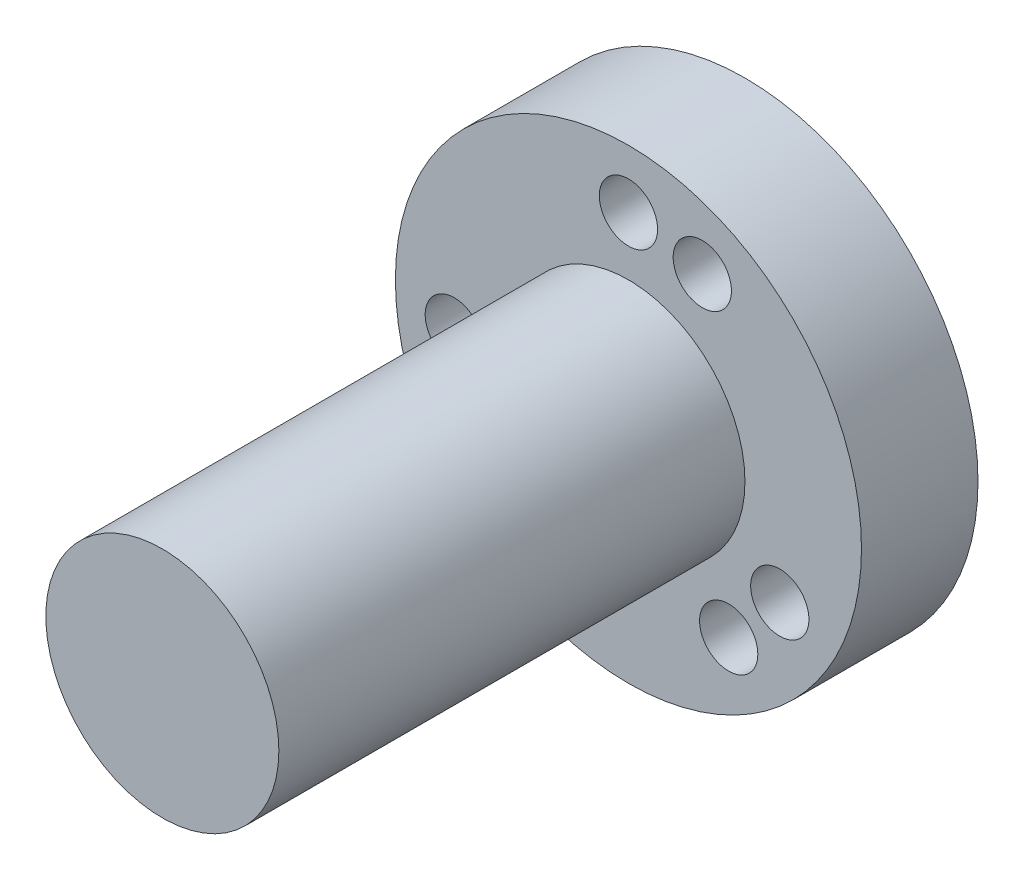
ISO-10303-21;
HEADER;
FILE_DESCRIPTION(('STEP AP214'),'2;1');
FILE_NAME('part.step','',(''),(''),'','','');
FILE_SCHEMA(('AUTOMOTIVE_DESIGN { 1 0 10303 214 1 1 1 1 }'));
ENDSEC;
DATA;
#1=APPLICATION_CONTEXT('core data for automotive mechanical design processes');
#2=APPLICATION_PROTOCOL_DEFINITION('international standard','automotive_design',2000,#1);
#3=PRODUCT_CONTEXT('',#1,'mechanical');
#4=PRODUCT('Part','Part','',(#3));
#5=PRODUCT_RELATED_PRODUCT_CATEGORY('part','',(#4));
#6=PRODUCT_DEFINITION_FORMATION('','',#4);
#7=PRODUCT_DEFINITION_CONTEXT('part definition',#1,'design');
#8=PRODUCT_DEFINITION('design','',#6,#7);
#9=PRODUCT_DEFINITION_SHAPE('','',#8);
#10=(LENGTH_UNIT() NAMED_UNIT(*) SI_UNIT(.MILLI.,.METRE.));
#11=(NAMED_UNIT(*) PLANE_ANGLE_UNIT() SI_UNIT($,.RADIAN.));
#12=(NAMED_UNIT(*) SI_UNIT($,.STERADIAN.) SOLID_ANGLE_UNIT());
#13=UNCERTAINTY_MEASURE_WITH_UNIT(LENGTH_MEASURE(1.E-05),#10,'distance_accuracy_value','');
#14=(GEOMETRIC_REPRESENTATION_CONTEXT(3) GLOBAL_UNCERTAINTY_ASSIGNED_CONTEXT((#13)) GLOBAL_UNIT_ASSIGNED_CONTEXT((#10,
#11,#12)) REPRESENTATION_CONTEXT('',''));
#15=CARTESIAN_POINT('',(0.,0.,0.));
#16=DIRECTION('',(0.,0.,1.));
#17=DIRECTION('',(1.,0.,0.));
#18=AXIS2_PLACEMENT_3D('',#15,#16,#17);
#19=CARTESIAN_POINT('',(0.,0.,1.));
#20=DIRECTION('',(0.,0.,-1.));
#21=DIRECTION('',(-1.,0.,0.));
#22=AXIS2_PLACEMENT_3D('',#19,#20,#21);
#23=CYLINDRICAL_SURFACE('',#22,2.5);
#24=CARTESIAN_POINT('',(0.,0.,1.));
#25=DIRECTION('',(0.,0.,1.));
#26=DIRECTION('',(1.,0.,0.));
#27=AXIS2_PLACEMENT_3D('',#24,#25,#26);
#28=CIRCLE('',#27,2.5);
#29=CARTESIAN_POINT('',(2.5,0.,1.));
#30=VERTEX_POINT('',#29);
#31=EDGE_CURVE('E10',#30,#30,#28,.T.);
#32=ORIENTED_EDGE('',*,*,#31,.F.);
#33=EDGE_LOOP('',(#32));
#34=FACE_BOUND('',#33,.T.);
#35=CARTESIAN_POINT('',(0.,0.,0.));
#36=DIRECTION('',(0.,0.,1.));
#37=DIRECTION('',(1.,0.,0.));
#38=AXIS2_PLACEMENT_3D('',#35,#36,#37);
#39=CIRCLE('',#38,2.5);
#40=CARTESIAN_POINT('',(2.5,0.,0.));
#41=VERTEX_POINT('',#40);
#42=EDGE_CURVE('E34',#41,#41,#39,.T.);
#43=ORIENTED_EDGE('',*,*,#42,.T.);
#44=EDGE_LOOP('',(#43));
#45=FACE_BOUND('',#44,.T.);
#46=ADVANCED_FACE('F31',(#34,#45),#23,.T.);
#47=CARTESIAN_POINT('',(0.,0.,0.));
#48=DIRECTION('',(0.,0.,1.));
#49=DIRECTION('',(1.,0.,0.));
#50=AXIS2_PLACEMENT_3D('',#47,#48,#49);
#51=PLANE('',#50);
#52=ORIENTED_EDGE('',*,*,#42,.F.);
#53=EDGE_LOOP('',(#52));
#54=FACE_BOUND('',#53,.T.);
#55=ADVANCED_FACE('F104',(#54),#51,.F.);
#56=CARTESIAN_POINT('',(0.,0.,4.));
#57=DIRECTION('',(0.,0.,1.));
#58=DIRECTION('',(1.,0.,0.));
#59=AXIS2_PLACEMENT_3D('',#56,#57,#58);
#60=PLANE('',#59);
#61=CARTESIAN_POINT('',(0.,0.,4.));
#62=DIRECTION('',(0.,0.,1.));
#63=DIRECTION('',(1.,0.,0.));
#64=AXIS2_PLACEMENT_3D('',#61,#62,#63);
#65=CIRCLE('',#64,3.);
#66=CARTESIAN_POINT('',(3.,0.,4.));
#67=VERTEX_POINT('',#66);
#68=EDGE_CURVE('E85',#67,#67,#65,.T.);
#69=ORIENTED_EDGE('',*,*,#68,.F.);
#70=EDGE_LOOP('',(#69));
#71=FACE_BOUND('',#70,.T.);
#72=CARTESIAN_POINT('',(-3.89711431702949,-2.25000000000028,4.));
#73=DIRECTION('',(0.,0.,1.));
#74=DIRECTION('',(1.,0.,0.));
#75=AXIS2_PLACEMENT_3D('',#72,#73,#74);
#76=CIRCLE('',#75,0.750000000000581);
#77=CARTESIAN_POINT('',(-3.14711431702891,-2.25000000000028,4.));
#78=VERTEX_POINT('',#77);
#79=EDGE_CURVE('E70',#78,#78,#76,.T.);
#80=ORIENTED_EDGE('',*,*,#79,.F.);
#81=EDGE_LOOP('',(#80));
#82=FACE_BOUND('',#81,.T.);
#83=CARTESIAN_POINT('',(3.89711431703045,-2.24999999999972,4.));
#84=DIRECTION('',(0.,0.,1.));
#85=DIRECTION('',(1.,0.,0.));
#86=AXIS2_PLACEMENT_3D('',#83,#84,#85);
#87=CIRCLE('',#86,0.750000000000399);
#88=CARTESIAN_POINT('',(4.64711431703085,-2.24999999999972,4.));
#89=VERTEX_POINT('',#88);
#90=EDGE_CURVE('E58',#89,#89,#87,.T.);
#91=ORIENTED_EDGE('',*,*,#90,.F.);
#92=EDGE_LOOP('',(#91));
#93=FACE_BOUND('',#92,.T.);
#94=CARTESIAN_POINT('',(0.,4.5,4.));
#95=DIRECTION('',(0.,0.,1.));
#96=DIRECTION('',(1.,0.,0.));
#97=AXIS2_PLACEMENT_3D('',#94,#95,#96);
#98=CIRCLE('',#97,0.75);
#99=CARTESIAN_POINT('',(0.75,4.5,4.));
#100=VERTEX_POINT('',#99);
#101=EDGE_CURVE('E46',#100,#100,#98,.T.);
#102=ORIENTED_EDGE('',*,*,#101,.F.);
#103=EDGE_LOOP('',(#102));
#104=FACE_BOUND('',#103,.T.);
#105=CARTESIAN_POINT('',(0.,0.,4.));
#106=DIRECTION('',(0.,0.,1.));
#107=DIRECTION('',(1.,0.,0.));
#108=AXIS2_PLACEMENT_3D('',#105,#106,#107);
#109=CIRCLE('',#108,6.);
#110=CARTESIAN_POINT('',(6.,0.,4.));
#111=VERTEX_POINT('',#110);
#112=EDGE_CURVE('E41',#111,#111,#109,.T.);
#113=ORIENTED_EDGE('',*,*,#112,.T.);
#114=EDGE_LOOP('',(#113));
#115=FACE_BOUND('',#114,.T.);
#116=CARTESIAN_POINT('',(1.90178217783312,4.07838504166494,4.));
#117=DIRECTION('',(0.,0.,1.));
#118=DIRECTION('',(1.,0.,0.));
#119=AXIS2_PLACEMENT_3D('',#116,#117,#118);
#120=CIRCLE('',#119,0.75);
#121=CARTESIAN_POINT('',(2.65178217783312,4.07838504166494,4.));
#122=VERTEX_POINT('',#121);
#123=EDGE_CURVE('E52',#122,#122,#120,.T.);
#124=ORIENTED_EDGE('',*,*,#123,.F.);
#125=EDGE_LOOP('',(#124));
#126=FACE_BOUND('',#125,.T.);
#127=CARTESIAN_POINT('',(2.58109396358021,-3.68618419930017,4.));
#128=DIRECTION('',(0.,0.,1.));
#129=DIRECTION('',(1.,0.,0.));
#130=AXIS2_PLACEMENT_3D('',#127,#128,#129);
#131=CIRCLE('',#130,0.750000000000394);
#132=CARTESIAN_POINT('',(3.3310939635806,-3.68618419930017,4.));
#133=VERTEX_POINT('',#132);
#134=EDGE_CURVE('E64',#133,#133,#131,.T.);
#135=ORIENTED_EDGE('',*,*,#134,.F.);
#136=EDGE_LOOP('',(#135));
#137=FACE_BOUND('',#136,.T.);
#138=CARTESIAN_POINT('',(-4.48287614141237,-0.392200842364769,4.));
#139=DIRECTION('',(0.,0.,1.));
#140=DIRECTION('',(1.,0.,0.));
#141=AXIS2_PLACEMENT_3D('',#138,#139,#140);
#142=CIRCLE('',#141,0.750000000000572);
#143=CARTESIAN_POINT('',(-3.7328761414118,-0.392200842364769,4.));
#144=VERTEX_POINT('',#143);
#145=EDGE_CURVE('E76',#144,#144,#142,.T.);
#146=ORIENTED_EDGE('',*,*,#145,.F.);
#147=EDGE_LOOP('',(#146));
#148=FACE_BOUND('',#147,.T.);
#149=ADVANCED_FACE('F100',(#71,#82,#93,#104,#115,#126,#137,#148),#60,.T.);
#150=CARTESIAN_POINT('',(0.,0.,1.));
#151=DIRECTION('',(0.,0.,1.));
#152=DIRECTION('',(1.,0.,0.));
#153=AXIS2_PLACEMENT_3D('',#150,#151,#152);
#154=PLANE('',#153);
#155=ORIENTED_EDGE('',*,*,#31,.T.);
#156=EDGE_LOOP('',(#155));
#157=FACE_BOUND('',#156,.T.);
#158=CARTESIAN_POINT('',(0.,0.,1.));
#159=DIRECTION('',(0.,0.,1.));
#160=DIRECTION('',(1.,0.,0.));
#161=AXIS2_PLACEMENT_3D('',#158,#159,#160);
#162=CIRCLE('',#161,6.);
#163=CARTESIAN_POINT('',(6.,0.,1.));
#164=VERTEX_POINT('',#163);
#165=EDGE_CURVE('E43',#164,#164,#162,.T.);
#166=ORIENTED_EDGE('',*,*,#165,.F.);
#167=EDGE_LOOP('',(#166));
#168=FACE_BOUND('',#167,.T.);
#169=CARTESIAN_POINT('',(0.,4.5,1.));
#170=DIRECTION('',(0.,0.,1.));
#171=DIRECTION('',(1.,0.,0.));
#172=AXIS2_PLACEMENT_3D('',#169,#170,#171);
#173=CIRCLE('',#172,0.75);
#174=CARTESIAN_POINT('',(0.75,4.5,1.));
#175=VERTEX_POINT('',#174);
#176=EDGE_CURVE('E49',#175,#175,#173,.T.);
#177=ORIENTED_EDGE('',*,*,#176,.T.);
#178=EDGE_LOOP('',(#177));
#179=FACE_BOUND('',#178,.T.);
#180=CARTESIAN_POINT('',(1.90178217783312,4.07838504166494,1.));
#181=DIRECTION('',(0.,0.,1.));
#182=DIRECTION('',(1.,0.,0.));
#183=AXIS2_PLACEMENT_3D('',#180,#181,#182);
#184=CIRCLE('',#183,0.75);
#185=CARTESIAN_POINT('',(2.65178217783312,4.07838504166494,1.));
#186=VERTEX_POINT('',#185);
#187=EDGE_CURVE('E55',#186,#186,#184,.T.);
#188=ORIENTED_EDGE('',*,*,#187,.T.);
#189=EDGE_LOOP('',(#188));
#190=FACE_BOUND('',#189,.T.);
#191=CARTESIAN_POINT('',(3.89711431703045,-2.24999999999972,1.));
#192=DIRECTION('',(0.,0.,1.));
#193=DIRECTION('',(1.,0.,0.));
#194=AXIS2_PLACEMENT_3D('',#191,#192,#193);
#195=CIRCLE('',#194,0.750000000000399);
#196=CARTESIAN_POINT('',(4.64711431703085,-2.24999999999972,1.));
#197=VERTEX_POINT('',#196);
#198=EDGE_CURVE('E61',#197,#197,#195,.T.);
#199=ORIENTED_EDGE('',*,*,#198,.T.);
#200=EDGE_LOOP('',(#199));
#201=FACE_BOUND('',#200,.T.);
#202=CARTESIAN_POINT('',(2.58109396358021,-3.68618419930017,1.));
#203=DIRECTION('',(0.,0.,1.));
#204=DIRECTION('',(1.,0.,0.));
#205=AXIS2_PLACEMENT_3D('',#202,#203,#204);
#206=CIRCLE('',#205,0.750000000000394);
#207=CARTESIAN_POINT('',(3.3310939635806,-3.68618419930017,1.));
#208=VERTEX_POINT('',#207);
#209=EDGE_CURVE('E67',#208,#208,#206,.T.);
#210=ORIENTED_EDGE('',*,*,#209,.T.);
#211=EDGE_LOOP('',(#210));
#212=FACE_BOUND('',#211,.T.);
#213=CARTESIAN_POINT('',(-3.89711431702949,-2.25000000000028,1.));
#214=DIRECTION('',(0.,0.,1.));
#215=DIRECTION('',(1.,0.,0.));
#216=AXIS2_PLACEMENT_3D('',#213,#214,#215);
#217=CIRCLE('',#216,0.750000000000581);
#218=CARTESIAN_POINT('',(-3.14711431702891,-2.25000000000028,1.));
#219=VERTEX_POINT('',#218);
#220=EDGE_CURVE('E73',#219,#219,#217,.T.);
#221=ORIENTED_EDGE('',*,*,#220,.T.);
#222=EDGE_LOOP('',(#221));
#223=FACE_BOUND('',#222,.T.);
#224=CARTESIAN_POINT('',(-4.48287614141237,-0.392200842364769,1.));
#225=DIRECTION('',(0.,0.,1.));
#226=DIRECTION('',(1.,0.,0.));
#227=AXIS2_PLACEMENT_3D('',#224,#225,#226);
#228=CIRCLE('',#227,0.750000000000572);
#229=CARTESIAN_POINT('',(-3.7328761414118,-0.392200842364769,1.));
#230=VERTEX_POINT('',#229);
#231=EDGE_CURVE('E79',#230,#230,#228,.T.);
#232=ORIENTED_EDGE('',*,*,#231,.T.);
#233=EDGE_LOOP('',(#232));
#234=FACE_BOUND('',#233,.T.);
#235=ADVANCED_FACE('F103',(#157,#168,#179,#190,#201,#212,#223,#234),#154,.F.);
#236=CARTESIAN_POINT('',(0.,0.,4.));
#237=DIRECTION('',(0.,0.,-1.));
#238=DIRECTION('',(-1.,0.,0.));
#239=AXIS2_PLACEMENT_3D('',#236,#237,#238);
#240=CYLINDRICAL_SURFACE('',#239,6.);
#241=ORIENTED_EDGE('',*,*,#112,.F.);
#242=EDGE_LOOP('',(#241));
#243=FACE_BOUND('',#242,.T.);
#244=ORIENTED_EDGE('',*,*,#165,.T.);
#245=EDGE_LOOP('',(#244));
#246=FACE_BOUND('',#245,.T.);
#247=ADVANCED_FACE('F127',(#243,#246),#240,.T.);
#248=CARTESIAN_POINT('',(0.,4.5,4.));
#249=DIRECTION('',(0.,0.,-1.));
#250=DIRECTION('',(-1.,0.,0.));
#251=AXIS2_PLACEMENT_3D('',#248,#249,#250);
#252=CYLINDRICAL_SURFACE('',#251,0.75);
#253=ORIENTED_EDGE('',*,*,#101,.T.);
#254=EDGE_LOOP('',(#253));
#255=FACE_BOUND('',#254,.T.);
#256=ORIENTED_EDGE('',*,*,#176,.F.);
#257=EDGE_LOOP('',(#256));
#258=FACE_BOUND('',#257,.T.);
#259=ADVANCED_FACE('F132',(#255,#258),#252,.F.);
#260=CARTESIAN_POINT('',(1.90178217783312,4.07838504166494,4.));
#261=DIRECTION('',(0.,0.,-1.));
#262=DIRECTION('',(-1.,0.,0.));
#263=AXIS2_PLACEMENT_3D('',#260,#261,#262);
#264=CYLINDRICAL_SURFACE('',#263,0.75);
#265=ORIENTED_EDGE('',*,*,#123,.T.);
#266=EDGE_LOOP('',(#265));
#267=FACE_BOUND('',#266,.T.);
#268=ORIENTED_EDGE('',*,*,#187,.F.);
#269=EDGE_LOOP('',(#268));
#270=FACE_BOUND('',#269,.T.);
#271=ADVANCED_FACE('F184',(#267,#270),#264,.F.);
#272=CARTESIAN_POINT('',(3.89711431703045,-2.24999999999972,4.));
#273=DIRECTION('',(0.,0.,-1.));
#274=DIRECTION('',(-1.,0.,0.));
#275=AXIS2_PLACEMENT_3D('',#272,#273,#274);
#276=CYLINDRICAL_SURFACE('',#275,0.750000000000399);
#277=ORIENTED_EDGE('',*,*,#90,.T.);
#278=EDGE_LOOP('',(#277));
#279=FACE_BOUND('',#278,.T.);
#280=ORIENTED_EDGE('',*,*,#198,.F.);
#281=EDGE_LOOP('',(#280));
#282=FACE_BOUND('',#281,.T.);
#283=ADVANCED_FACE('F180',(#279,#282),#276,.F.);
#284=CARTESIAN_POINT('',(2.58109396358021,-3.68618419930017,4.));
#285=DIRECTION('',(0.,0.,-1.));
#286=DIRECTION('',(-1.,0.,0.));
#287=AXIS2_PLACEMENT_3D('',#284,#285,#286);
#288=CYLINDRICAL_SURFACE('',#287,0.750000000000394);
#289=ORIENTED_EDGE('',*,*,#134,.T.);
#290=EDGE_LOOP('',(#289));
#291=FACE_BOUND('',#290,.T.);
#292=ORIENTED_EDGE('',*,*,#209,.F.);
#293=EDGE_LOOP('',(#292));
#294=FACE_BOUND('',#293,.T.);
#295=ADVANCED_FACE('F176',(#291,#294),#288,.F.);
#296=CARTESIAN_POINT('',(-3.89711431702949,-2.25000000000028,4.));
#297=DIRECTION('',(0.,0.,-1.));
#298=DIRECTION('',(-1.,0.,0.));
#299=AXIS2_PLACEMENT_3D('',#296,#297,#298);
#300=CYLINDRICAL_SURFACE('',#299,0.750000000000581);
#301=ORIENTED_EDGE('',*,*,#79,.T.);
#302=EDGE_LOOP('',(#301));
#303=FACE_BOUND('',#302,.T.);
#304=ORIENTED_EDGE('',*,*,#220,.F.);
#305=EDGE_LOOP('',(#304));
#306=FACE_BOUND('',#305,.T.);
#307=ADVANCED_FACE('F122',(#303,#306),#300,.F.);
#308=CARTESIAN_POINT('',(-4.48287614141237,-0.392200842364769,4.));
#309=DIRECTION('',(0.,0.,-1.));
#310=DIRECTION('',(-1.,0.,0.));
#311=AXIS2_PLACEMENT_3D('',#308,#309,#310);
#312=CYLINDRICAL_SURFACE('',#311,0.750000000000572);
#313=ORIENTED_EDGE('',*,*,#145,.T.);
#314=EDGE_LOOP('',(#313));
#315=FACE_BOUND('',#314,.T.);
#316=ORIENTED_EDGE('',*,*,#231,.F.);
#317=EDGE_LOOP('',(#316));
#318=FACE_BOUND('',#317,.T.);
#319=ADVANCED_FACE('F96',(#315,#318),#312,.F.);
#320=CARTESIAN_POINT('',(0.,0.,16.));
#321=DIRECTION('',(0.,0.,-1.));
#322=DIRECTION('',(-1.,0.,0.));
#323=AXIS2_PLACEMENT_3D('',#320,#321,#322);
#324=CYLINDRICAL_SURFACE('',#323,3.);
#325=CARTESIAN_POINT('',(0.,0.,16.));
#326=DIRECTION('',(0.,0.,1.));
#327=DIRECTION('',(1.,0.,0.));
#328=AXIS2_PLACEMENT_3D('',#325,#326,#327);
#329=CIRCLE('',#328,3.);
#330=CARTESIAN_POINT('',(3.,0.,16.));
#331=VERTEX_POINT('',#330);
#332=EDGE_CURVE('E82',#331,#331,#329,.T.);
#333=ORIENTED_EDGE('',*,*,#332,.F.);
#334=EDGE_LOOP('',(#333));
#335=FACE_BOUND('',#334,.T.);
#336=ORIENTED_EDGE('',*,*,#68,.T.);
#337=EDGE_LOOP('',(#336));
#338=FACE_BOUND('',#337,.T.);
#339=ADVANCED_FACE('F93',(#335,#338),#324,.T.);
#340=CARTESIAN_POINT('',(0.,0.,16.));
#341=DIRECTION('',(0.,0.,1.));
#342=DIRECTION('',(1.,0.,0.));
#343=AXIS2_PLACEMENT_3D('',#340,#341,#342);
#344=PLANE('',#343);
#345=ORIENTED_EDGE('',*,*,#332,.T.);
#346=EDGE_LOOP('',(#345));
#347=FACE_BOUND('',#346,.T.);
#348=ADVANCED_FACE('F91',(#347),#344,.T.);
#349=CLOSED_SHELL('',(#46,#55,#149,#235,#247,#259,#271,#283,#295,#307,#319,#339,#348));
#350=MANIFOLD_SOLID_BREP('B2',#349);
#351=ADVANCED_BREP_SHAPE_REPRESENTATION('',(#18,#350),#14);
#352=SHAPE_DEFINITION_REPRESENTATION(#9,#351);
ENDSEC;
END-ISO-10303-21;
